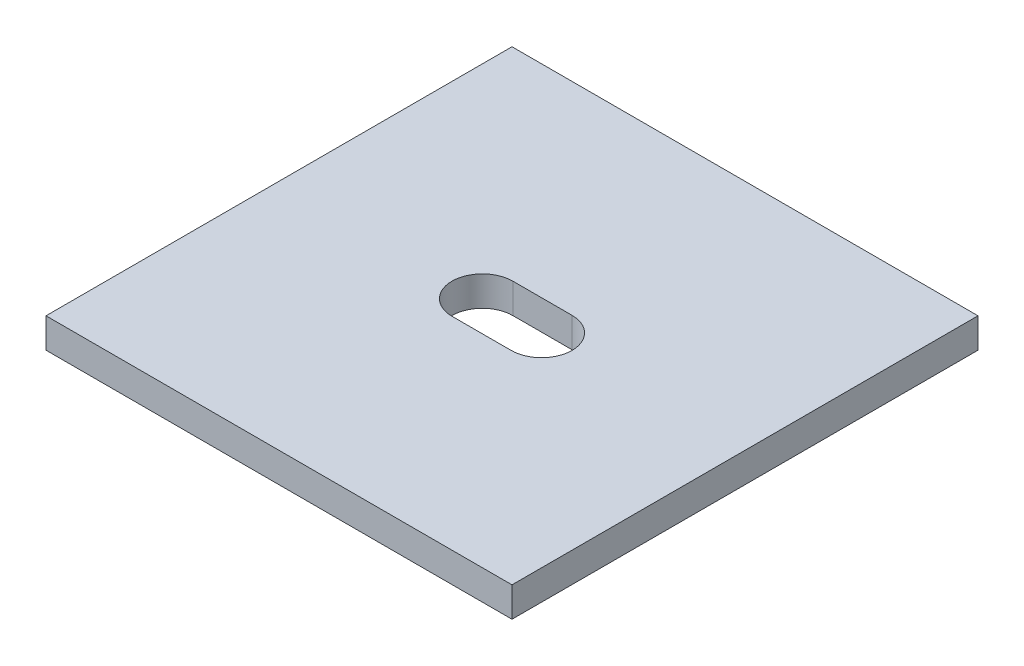
ISO-10303-21;
HEADER;
FILE_DESCRIPTION(('STEP AP214'),'2;1');
FILE_NAME('part.step','',(''),(''),'','','');
FILE_SCHEMA(('AUTOMOTIVE_DESIGN { 1 0 10303 214 1 1 1 1 }'));
ENDSEC;
DATA;
#1=APPLICATION_CONTEXT('core data for automotive mechanical design processes');
#2=APPLICATION_PROTOCOL_DEFINITION('international standard','automotive_design',2000,#1);
#3=PRODUCT_CONTEXT('',#1,'mechanical');
#4=PRODUCT('Part','Part','',(#3));
#5=PRODUCT_RELATED_PRODUCT_CATEGORY('part','',(#4));
#6=PRODUCT_DEFINITION_FORMATION('','',#4);
#7=PRODUCT_DEFINITION_CONTEXT('part definition',#1,'design');
#8=PRODUCT_DEFINITION('design','',#6,#7);
#9=PRODUCT_DEFINITION_SHAPE('','',#8);
#10=(LENGTH_UNIT() NAMED_UNIT(*) SI_UNIT(.MILLI.,.METRE.));
#11=(NAMED_UNIT(*) PLANE_ANGLE_UNIT() SI_UNIT($,.RADIAN.));
#12=(NAMED_UNIT(*) SI_UNIT($,.STERADIAN.) SOLID_ANGLE_UNIT());
#13=UNCERTAINTY_MEASURE_WITH_UNIT(LENGTH_MEASURE(1.E-05),#10,'distance_accuracy_value','');
#14=(GEOMETRIC_REPRESENTATION_CONTEXT(3) GLOBAL_UNCERTAINTY_ASSIGNED_CONTEXT((#13)) GLOBAL_UNIT_ASSIGNED_CONTEXT((#10,
#11,#12)) REPRESENTATION_CONTEXT('',''));
#15=CARTESIAN_POINT('',(0.,0.,0.));
#16=DIRECTION('',(0.,0.,1.));
#17=DIRECTION('',(1.,0.,0.));
#18=AXIS2_PLACEMENT_3D('',#15,#16,#17);
#19=CARTESIAN_POINT('',(25.,3.2,-25.));
#20=DIRECTION('',(-1.,0.,0.));
#21=DIRECTION('',(0.,0.,1.));
#22=AXIS2_PLACEMENT_3D('',#19,#20,#21);
#23=PLANE('',#22);
#24=DIRECTION('',(0.,0.,-1.));
#25=VECTOR('',#24,1.);
#26=CARTESIAN_POINT('',(25.,0.,-25.));
#27=LINE('',#26,#25);
#28=CARTESIAN_POINT('',(25.,0.,25.));
#29=VERTEX_POINT('',#28);
#30=CARTESIAN_POINT('',(25.,0.,-25.));
#31=VERTEX_POINT('',#30);
#32=EDGE_CURVE('E212',#29,#31,#27,.T.);
#33=ORIENTED_EDGE('',*,*,#32,.T.);
#34=DIRECTION('',(0.,-1.,0.));
#35=VECTOR('',#34,1.);
#36=CARTESIAN_POINT('',(25.,3.2,-25.));
#37=LINE('',#36,#35);
#38=CARTESIAN_POINT('',(25.,3.2,-25.));
#39=VERTEX_POINT('',#38);
#40=EDGE_CURVE('E239',#39,#31,#37,.T.);
#41=ORIENTED_EDGE('',*,*,#40,.F.);
#42=DIRECTION('',(0.,0.,-1.));
#43=VECTOR('',#42,1.);
#44=CARTESIAN_POINT('',(25.,3.2,-25.));
#45=LINE('',#44,#43);
#46=CARTESIAN_POINT('',(25.,3.2,25.));
#47=VERTEX_POINT('',#46);
#48=EDGE_CURVE('E213',#47,#39,#45,.T.);
#49=ORIENTED_EDGE('',*,*,#48,.F.);
#50=DIRECTION('',(0.,-1.,0.));
#51=VECTOR('',#50,1.);
#52=CARTESIAN_POINT('',(25.,3.2,25.));
#53=LINE('',#52,#51);
#54=EDGE_CURVE('E223',#47,#29,#53,.T.);
#55=ORIENTED_EDGE('',*,*,#54,.T.);
#56=EDGE_LOOP('',(#33,#41,#49,#55));
#57=FACE_BOUND('',#56,.T.);
#58=ADVANCED_FACE('F121',(#57),#23,.F.);
#59=CARTESIAN_POINT('',(-25.,3.2,-25.));
#60=DIRECTION('',(0.,0.,1.));
#61=DIRECTION('',(1.,0.,0.));
#62=AXIS2_PLACEMENT_3D('',#59,#60,#61);
#63=PLANE('',#62);
#64=DIRECTION('',(-1.,0.,0.));
#65=VECTOR('',#64,1.);
#66=CARTESIAN_POINT('',(-25.,0.,-25.));
#67=LINE('',#66,#65);
#68=CARTESIAN_POINT('',(-25.,0.,-25.));
#69=VERTEX_POINT('',#68);
#70=EDGE_CURVE('E226',#31,#69,#67,.T.);
#71=ORIENTED_EDGE('',*,*,#70,.T.);
#72=DIRECTION('',(0.,-1.,0.));
#73=VECTOR('',#72,1.);
#74=CARTESIAN_POINT('',(-25.,3.2,-25.));
#75=LINE('',#74,#73);
#76=CARTESIAN_POINT('',(-25.,3.2,-25.));
#77=VERTEX_POINT('',#76);
#78=EDGE_CURVE('E236',#77,#69,#75,.T.);
#79=ORIENTED_EDGE('',*,*,#78,.F.);
#80=DIRECTION('',(-1.,0.,0.));
#81=VECTOR('',#80,1.);
#82=CARTESIAN_POINT('',(-25.,3.2,-25.));
#83=LINE('',#82,#81);
#84=EDGE_CURVE('E216',#39,#77,#83,.T.);
#85=ORIENTED_EDGE('',*,*,#84,.F.);
#86=ORIENTED_EDGE('',*,*,#40,.T.);
#87=EDGE_LOOP('',(#71,#79,#85,#86));
#88=FACE_BOUND('',#87,.T.);
#89=ADVANCED_FACE('F262',(#88),#63,.F.);
#90=CARTESIAN_POINT('',(-25.,3.2,-25.));
#91=DIRECTION('',(1.,0.,0.));
#92=DIRECTION('',(0.,0.,-1.));
#93=AXIS2_PLACEMENT_3D('',#90,#91,#92);
#94=PLANE('',#93);
#95=DIRECTION('',(0.,0.,1.));
#96=VECTOR('',#95,1.);
#97=CARTESIAN_POINT('',(-25.,0.,-25.));
#98=LINE('',#97,#96);
#99=CARTESIAN_POINT('',(-25.,0.,25.));
#100=VERTEX_POINT('',#99);
#101=EDGE_CURVE('E228',#69,#100,#98,.T.);
#102=ORIENTED_EDGE('',*,*,#101,.T.);
#103=DIRECTION('',(0.,-1.,0.));
#104=VECTOR('',#103,1.);
#105=CARTESIAN_POINT('',(-25.,3.2,25.));
#106=LINE('',#105,#104);
#107=CARTESIAN_POINT('',(-25.,3.2,25.));
#108=VERTEX_POINT('',#107);
#109=EDGE_CURVE('E233',#108,#100,#106,.T.);
#110=ORIENTED_EDGE('',*,*,#109,.F.);
#111=DIRECTION('',(0.,0.,1.));
#112=VECTOR('',#111,1.);
#113=CARTESIAN_POINT('',(-25.,3.2,-25.));
#114=LINE('',#113,#112);
#115=EDGE_CURVE('E219',#77,#108,#114,.T.);
#116=ORIENTED_EDGE('',*,*,#115,.F.);
#117=ORIENTED_EDGE('',*,*,#78,.T.);
#118=EDGE_LOOP('',(#102,#110,#116,#117));
#119=FACE_BOUND('',#118,.T.);
#120=ADVANCED_FACE('F267',(#119),#94,.F.);
#121=CARTESIAN_POINT('',(-25.,3.2,25.));
#122=DIRECTION('',(0.,0.,-1.));
#123=DIRECTION('',(-1.,0.,0.));
#124=AXIS2_PLACEMENT_3D('',#121,#122,#123);
#125=PLANE('',#124);
#126=DIRECTION('',(1.,0.,0.));
#127=VECTOR('',#126,1.);
#128=CARTESIAN_POINT('',(-25.,0.,25.));
#129=LINE('',#128,#127);
#130=EDGE_CURVE('E217',#100,#29,#129,.T.);
#131=ORIENTED_EDGE('',*,*,#130,.T.);
#132=ORIENTED_EDGE('',*,*,#54,.F.);
#133=DIRECTION('',(1.,0.,0.));
#134=VECTOR('',#133,1.);
#135=CARTESIAN_POINT('',(-25.,3.2,25.));
#136=LINE('',#135,#134);
#137=EDGE_CURVE('E221',#108,#47,#136,.T.);
#138=ORIENTED_EDGE('',*,*,#137,.F.);
#139=ORIENTED_EDGE('',*,*,#109,.T.);
#140=EDGE_LOOP('',(#131,#132,#138,#139));
#141=FACE_BOUND('',#140,.T.);
#142=ADVANCED_FACE('F280',(#141),#125,.F.);
#143=CARTESIAN_POINT('',(0.,3.2,0.));
#144=DIRECTION('',(0.,1.,0.));
#145=DIRECTION('',(0.,0.,1.));
#146=AXIS2_PLACEMENT_3D('',#143,#144,#145);
#147=PLANE('',#146);
#148=CARTESIAN_POINT('',(3.175,3.2,0.));
#149=DIRECTION('',(0.,1.,0.));
#150=DIRECTION('',(0.,0.,1.));
#151=AXIS2_PLACEMENT_3D('',#148,#149,#150);
#152=CIRCLE('',#151,3.26389999999999);
#153=CARTESIAN_POINT('',(3.175,3.2,3.26390000000004));
#154=VERTEX_POINT('',#153);
#155=CARTESIAN_POINT('',(3.175,3.2,-3.26389999999999));
#156=VERTEX_POINT('',#155);
#157=EDGE_CURVE('E193',#154,#156,#152,.T.);
#158=ORIENTED_EDGE('',*,*,#157,.F.);
#159=DIRECTION('',(1.,0.,0.));
#160=VECTOR('',#159,1.);
#161=CARTESIAN_POINT('',(-3.175,3.2,3.26390000000004));
#162=LINE('',#161,#160);
#163=CARTESIAN_POINT('',(-3.175,3.2,3.26389999999999));
#164=VERTEX_POINT('',#163);
#165=EDGE_CURVE('E203',#164,#154,#162,.T.);
#166=ORIENTED_EDGE('',*,*,#165,.F.);
#167=CARTESIAN_POINT('',(-3.175,3.2,0.));
#168=DIRECTION('',(0.,1.,0.));
#169=DIRECTION('',(0.,0.,1.));
#170=AXIS2_PLACEMENT_3D('',#167,#168,#169);
#171=CIRCLE('',#170,3.26389999999999);
#172=CARTESIAN_POINT('',(-3.175,3.2,-3.26389999999999));
#173=VERTEX_POINT('',#172);
#174=EDGE_CURVE('E202',#173,#164,#171,.T.);
#175=ORIENTED_EDGE('',*,*,#174,.F.);
#176=DIRECTION('',(1.,0.,0.));
#177=VECTOR('',#176,1.);
#178=CARTESIAN_POINT('',(-3.175,3.2,-3.26389999999999));
#179=LINE('',#178,#177);
#180=EDGE_CURVE('E189',#173,#156,#179,.T.);
#181=ORIENTED_EDGE('',*,*,#180,.T.);
#182=EDGE_LOOP('',(#158,#166,#175,#181));
#183=FACE_BOUND('',#182,.T.);
#184=ORIENTED_EDGE('',*,*,#48,.T.);
#185=ORIENTED_EDGE('',*,*,#84,.T.);
#186=ORIENTED_EDGE('',*,*,#115,.T.);
#187=ORIENTED_EDGE('',*,*,#137,.T.);
#188=EDGE_LOOP('',(#184,#185,#186,#187));
#189=FACE_BOUND('',#188,.T.);
#190=ADVANCED_FACE('F200',(#183,#189),#147,.T.);
#191=CARTESIAN_POINT('',(0.,0.,0.));
#192=DIRECTION('',(0.,1.,0.));
#193=DIRECTION('',(0.,0.,1.));
#194=AXIS2_PLACEMENT_3D('',#191,#192,#193);
#195=PLANE('',#194);
#196=CARTESIAN_POINT('',(3.175,0.,0.));
#197=DIRECTION('',(0.,1.,0.));
#198=DIRECTION('',(0.,0.,1.));
#199=AXIS2_PLACEMENT_3D('',#196,#197,#198);
#200=CIRCLE('',#199,3.26389999999999);
#201=CARTESIAN_POINT('',(3.175,0.,3.26389999999999));
#202=VERTEX_POINT('',#201);
#203=CARTESIAN_POINT('',(3.175,0.,-3.26389999999999));
#204=VERTEX_POINT('',#203);
#205=EDGE_CURVE('E128',#202,#204,#200,.T.);
#206=ORIENTED_EDGE('',*,*,#205,.T.);
#207=DIRECTION('',(-1.,0.,0.));
#208=VECTOR('',#207,1.);
#209=CARTESIAN_POINT('',(0.,0.,-3.26389999999999));
#210=LINE('',#209,#208);
#211=CARTESIAN_POINT('',(-3.175,0.,-3.26389999999999));
#212=VERTEX_POINT('',#211);
#213=EDGE_CURVE('E13',#204,#212,#210,.T.);
#214=ORIENTED_EDGE('',*,*,#213,.T.);
#215=CARTESIAN_POINT('',(-3.175,0.,0.));
#216=DIRECTION('',(0.,1.,0.));
#217=DIRECTION('',(0.,0.,1.));
#218=AXIS2_PLACEMENT_3D('',#215,#216,#217);
#219=CIRCLE('',#218,3.26389999999999);
#220=CARTESIAN_POINT('',(-3.175,0.,3.26389999999999));
#221=VERTEX_POINT('',#220);
#222=EDGE_CURVE('E245',#212,#221,#219,.T.);
#223=ORIENTED_EDGE('',*,*,#222,.T.);
#224=DIRECTION('',(1.,0.,0.));
#225=VECTOR('',#224,1.);
#226=CARTESIAN_POINT('',(0.,0.,3.26389999999999));
#227=LINE('',#226,#225);
#228=EDGE_CURVE('E242',#221,#202,#227,.T.);
#229=ORIENTED_EDGE('',*,*,#228,.T.);
#230=EDGE_LOOP('',(#206,#214,#223,#229));
#231=FACE_BOUND('',#230,.T.);
#232=ORIENTED_EDGE('',*,*,#32,.F.);
#233=ORIENTED_EDGE('',*,*,#130,.F.);
#234=ORIENTED_EDGE('',*,*,#101,.F.);
#235=ORIENTED_EDGE('',*,*,#70,.F.);
#236=EDGE_LOOP('',(#232,#233,#234,#235));
#237=FACE_BOUND('',#236,.T.);
#238=ADVANCED_FACE('F248',(#231,#237),#195,.F.);
#239=CARTESIAN_POINT('',(3.175,3.2,0.));
#240=DIRECTION('',(0.,1.,0.));
#241=DIRECTION('',(0.,0.,1.));
#242=AXIS2_PLACEMENT_3D('',#239,#240,#241);
#243=CYLINDRICAL_SURFACE('',#242,3.26389999999999);
#244=DIRECTION('',(0.,1.,0.));
#245=VECTOR('',#244,1.);
#246=CARTESIAN_POINT('',(3.175,3.2,3.26389999999999));
#247=LINE('',#246,#245);
#248=EDGE_CURVE('E135',#154,#202,#247,.F.);
#249=ORIENTED_EDGE('',*,*,#248,.F.);
#250=ORIENTED_EDGE('',*,*,#157,.T.);
#251=DIRECTION('',(0.,1.,0.));
#252=VECTOR('',#251,1.);
#253=CARTESIAN_POINT('',(3.175,3.2,-3.26389999999999));
#254=LINE('',#253,#252);
#255=EDGE_CURVE('E185',#204,#156,#254,.T.);
#256=ORIENTED_EDGE('',*,*,#255,.F.);
#257=ORIENTED_EDGE('',*,*,#205,.F.);
#258=EDGE_LOOP('',(#249,#250,#256,#257));
#259=FACE_BOUND('',#258,.T.);
#260=ADVANCED_FACE('F196',(#259),#243,.F.);
#261=CARTESIAN_POINT('',(-3.175,3.2,0.));
#262=DIRECTION('',(0.,1.,0.));
#263=DIRECTION('',(0.,0.,1.));
#264=AXIS2_PLACEMENT_3D('',#261,#262,#263);
#265=CYLINDRICAL_SURFACE('',#264,3.26389999999999);
#266=DIRECTION('',(0.,1.,0.));
#267=VECTOR('',#266,1.);
#268=CARTESIAN_POINT('',(-3.175,3.2,-3.26389999999999));
#269=LINE('',#268,#267);
#270=EDGE_CURVE('E143',#173,#212,#269,.F.);
#271=ORIENTED_EDGE('',*,*,#270,.F.);
#272=ORIENTED_EDGE('',*,*,#174,.T.);
#273=DIRECTION('',(0.,1.,0.));
#274=VECTOR('',#273,1.);
#275=CARTESIAN_POINT('',(-3.175,3.2,3.26389999999999));
#276=LINE('',#275,#274);
#277=EDGE_CURVE('E205',#221,#164,#276,.T.);
#278=ORIENTED_EDGE('',*,*,#277,.F.);
#279=ORIENTED_EDGE('',*,*,#222,.F.);
#280=EDGE_LOOP('',(#271,#272,#278,#279));
#281=FACE_BOUND('',#280,.T.);
#282=ADVANCED_FACE('F252',(#281),#265,.F.);
#283=CARTESIAN_POINT('',(-3.175,3.2,-3.26389999999999));
#284=DIRECTION('',(0.,0.,-1.));
#285=DIRECTION('',(-1.,0.,0.));
#286=AXIS2_PLACEMENT_3D('',#283,#284,#285);
#287=PLANE('',#286);
#288=ORIENTED_EDGE('',*,*,#255,.T.);
#289=ORIENTED_EDGE('',*,*,#180,.F.);
#290=ORIENTED_EDGE('',*,*,#270,.T.);
#291=ORIENTED_EDGE('',*,*,#213,.F.);
#292=EDGE_LOOP('',(#288,#289,#290,#291));
#293=FACE_BOUND('',#292,.T.);
#294=ADVANCED_FACE('F187',(#293),#287,.F.);
#295=CARTESIAN_POINT('',(-3.175,3.2,3.26389999999999));
#296=DIRECTION('',(0.,0.,1.));
#297=DIRECTION('',(1.,0.,0.));
#298=AXIS2_PLACEMENT_3D('',#295,#296,#297);
#299=PLANE('',#298);
#300=ORIENTED_EDGE('',*,*,#277,.T.);
#301=ORIENTED_EDGE('',*,*,#165,.T.);
#302=ORIENTED_EDGE('',*,*,#248,.T.);
#303=ORIENTED_EDGE('',*,*,#228,.F.);
#304=EDGE_LOOP('',(#300,#301,#302,#303));
#305=FACE_BOUND('',#304,.T.);
#306=ADVANCED_FACE('F251',(#305),#299,.F.);
#307=CLOSED_SHELL('',(#58,#89,#120,#142,#190,#238,#260,#282,#294,#306));
#308=MANIFOLD_SOLID_BREP('B2',#307);
#309=ADVANCED_BREP_SHAPE_REPRESENTATION('',(#18,#308),#14);
#310=SHAPE_DEFINITION_REPRESENTATION(#9,#309);
ENDSEC;
END-ISO-10303-21;
